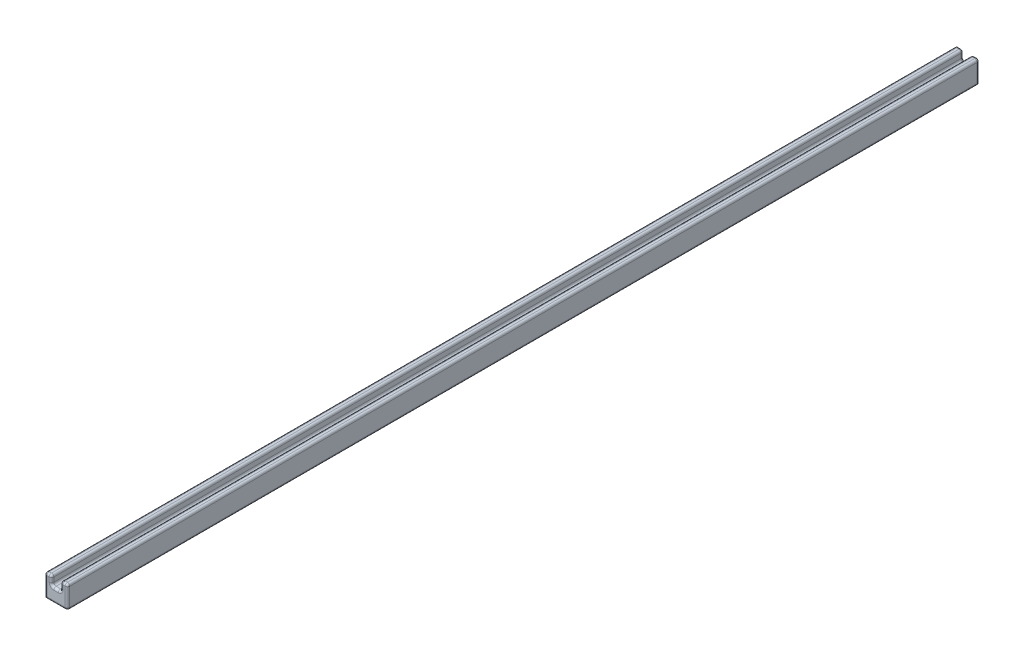
ISO-10303-21;
HEADER;
FILE_DESCRIPTION(('STEP AP214'),'2;1');
FILE_NAME('part.step','',(''),(''),'','','');
FILE_SCHEMA(('AUTOMOTIVE_DESIGN { 1 0 10303 214 1 1 1 1 }'));
ENDSEC;
DATA;
#1=APPLICATION_CONTEXT('core data for automotive mechanical design processes');
#2=APPLICATION_PROTOCOL_DEFINITION('international standard','automotive_design',2000,#1);
#3=PRODUCT_CONTEXT('',#1,'mechanical');
#4=PRODUCT('Part','Part','',(#3));
#5=PRODUCT_RELATED_PRODUCT_CATEGORY('part','',(#4));
#6=PRODUCT_DEFINITION_FORMATION('','',#4);
#7=PRODUCT_DEFINITION_CONTEXT('part definition',#1,'design');
#8=PRODUCT_DEFINITION('design','',#6,#7);
#9=PRODUCT_DEFINITION_SHAPE('','',#8);
#10=(LENGTH_UNIT() NAMED_UNIT(*) SI_UNIT(.MILLI.,.METRE.));
#11=(NAMED_UNIT(*) PLANE_ANGLE_UNIT() SI_UNIT($,.RADIAN.));
#12=(NAMED_UNIT(*) SI_UNIT($,.STERADIAN.) SOLID_ANGLE_UNIT());
#13=UNCERTAINTY_MEASURE_WITH_UNIT(LENGTH_MEASURE(1.E-05),#10,'distance_accuracy_value','');
#14=(GEOMETRIC_REPRESENTATION_CONTEXT(3) GLOBAL_UNCERTAINTY_ASSIGNED_CONTEXT((#13)) GLOBAL_UNIT_ASSIGNED_CONTEXT((#10,
#11,#12)) REPRESENTATION_CONTEXT('',''));
#15=CARTESIAN_POINT('',(0.,0.,0.));
#16=DIRECTION('',(0.,0.,1.));
#17=DIRECTION('',(1.,0.,0.));
#18=AXIS2_PLACEMENT_3D('',#15,#16,#17);
#19=CARTESIAN_POINT('',(0.,-3.02645502645503,-200.));
#20=DIRECTION('',(0.,-1.,0.));
#21=DIRECTION('',(0.,0.,-1.));
#22=AXIS2_PLACEMENT_3D('',#19,#20,#21);
#23=PLANE('',#22);
#24=DIRECTION('',(1.,0.,0.));
#25=VECTOR('',#24,1.);
#26=CARTESIAN_POINT('',(0.,-3.02645502645503,-199.5));
#27=LINE('',#26,#25);
#28=CARTESIAN_POINT('',(15.2857142857143,-3.02645502645503,-199.5));
#29=VERTEX_POINT('',#28);
#30=CARTESIAN_POINT('',(14.7857142857143,-3.02645502645503,-199.5));
#31=VERTEX_POINT('',#30);
#32=EDGE_CURVE('E246',#29,#31,#27,.F.);
#33=ORIENTED_EDGE('',*,*,#32,.T.);
#34=DIRECTION('',(0.,0.,1.));
#35=VECTOR('',#34,1.);
#36=CARTESIAN_POINT('',(14.7857142857143,-3.02645502645503,0.));
#37=LINE('',#36,#35);
#38=CARTESIAN_POINT('',(14.7857142857143,-3.02645502645503,-0.5));
#39=VERTEX_POINT('',#38);
#40=EDGE_CURVE('E251',#31,#39,#37,.T.);
#41=ORIENTED_EDGE('',*,*,#40,.T.);
#42=DIRECTION('',(1.,0.,0.));
#43=VECTOR('',#42,1.);
#44=CARTESIAN_POINT('',(15.7857142857143,-3.02645502645503,-0.5));
#45=LINE('',#44,#43);
#46=CARTESIAN_POINT('',(15.2857142857143,-3.02645502645503,-0.5));
#47=VERTEX_POINT('',#46);
#48=EDGE_CURVE('E248',#39,#47,#45,.T.);
#49=ORIENTED_EDGE('',*,*,#48,.T.);
#50=DIRECTION('',(0.,0.,1.));
#51=VECTOR('',#50,1.);
#52=CARTESIAN_POINT('',(15.2857142857143,-3.02645502645503,-200.));
#53=LINE('',#52,#51);
#54=EDGE_CURVE('E244',#47,#29,#53,.F.);
#55=ORIENTED_EDGE('',*,*,#54,.T.);
#56=EDGE_LOOP('',(#33,#41,#49,#55));
#57=FACE_BOUND('',#56,.T.);
#58=ADVANCED_FACE('F36',(#57),#23,.F.);
#59=CARTESIAN_POINT('',(15.7857142857143,0.,-200.));
#60=DIRECTION('',(-1.,0.,0.));
#61=DIRECTION('',(0.,0.,1.));
#62=AXIS2_PLACEMENT_3D('',#59,#60,#61);
#63=PLANE('',#62);
#64=DIRECTION('',(0.,-1.,0.));
#65=VECTOR('',#64,1.);
#66=CARTESIAN_POINT('',(15.7857142857143,-8.02645502645503,-0.5));
#67=LINE('',#66,#65);
#68=CARTESIAN_POINT('',(15.7857142857143,-3.52645502645503,-0.5));
#69=VERTEX_POINT('',#68);
#70=CARTESIAN_POINT('',(15.7857142857143,-7.52645502645503,-0.5));
#71=VERTEX_POINT('',#70);
#72=EDGE_CURVE('E45',#69,#71,#67,.T.);
#73=ORIENTED_EDGE('',*,*,#72,.T.);
#74=DIRECTION('',(0.,0.,1.));
#75=VECTOR('',#74,1.);
#76=CARTESIAN_POINT('',(15.7857142857143,-7.52645502645503,-200.));
#77=LINE('',#76,#75);
#78=CARTESIAN_POINT('',(15.7857142857143,-7.52645502645503,-199.5));
#79=VERTEX_POINT('',#78);
#80=EDGE_CURVE('E11',#71,#79,#77,.F.);
#81=ORIENTED_EDGE('',*,*,#80,.T.);
#82=DIRECTION('',(0.,-1.,0.));
#83=VECTOR('',#82,1.);
#84=CARTESIAN_POINT('',(15.7857142857143,0.,-199.5));
#85=LINE('',#84,#83);
#86=CARTESIAN_POINT('',(15.7857142857143,-3.52645502645503,-199.5));
#87=VERTEX_POINT('',#86);
#88=EDGE_CURVE('E311',#79,#87,#85,.F.);
#89=ORIENTED_EDGE('',*,*,#88,.T.);
#90=DIRECTION('',(0.,0.,1.));
#91=VECTOR('',#90,1.);
#92=CARTESIAN_POINT('',(15.7857142857143,-3.52645502645503,-200.));
#93=LINE('',#92,#91);
#94=EDGE_CURVE('E309',#87,#69,#93,.T.);
#95=ORIENTED_EDGE('',*,*,#94,.T.);
#96=EDGE_LOOP('',(#73,#81,#89,#95));
#97=FACE_BOUND('',#96,.T.);
#98=ADVANCED_FACE('F496',(#97),#63,.F.);
#99=CARTESIAN_POINT('',(0.,-8.02645502645502,-200.));
#100=DIRECTION('',(0.,-1.,0.));
#101=DIRECTION('',(1.,0.,0.));
#102=AXIS2_PLACEMENT_3D('',#99,#100,#101);
#103=PLANE('',#102);
#104=DIRECTION('',(0.,0.,1.));
#105=VECTOR('',#104,1.);
#106=CARTESIAN_POINT('',(15.2857142857143,-8.02645502645503,0.));
#107=LINE('',#106,#105);
#108=CARTESIAN_POINT('',(15.2857142857143,-8.02645502645503,-200.));
#109=VERTEX_POINT('',#108);
#110=CARTESIAN_POINT('',(15.2857142857143,-8.02645502645503,-0.5));
#111=VERTEX_POINT('',#110);
#112=EDGE_CURVE('E306',#109,#111,#107,.T.);
#113=ORIENTED_EDGE('',*,*,#112,.T.);
#114=DIRECTION('',(1.,0.,0.));
#115=VECTOR('',#114,1.);
#116=CARTESIAN_POINT('',(0.,-8.02645502645502,-0.5));
#117=LINE('',#116,#115);
#118=CARTESIAN_POINT('',(10.7857142857143,-8.02645502645503,-0.5));
#119=VERTEX_POINT('',#118);
#120=EDGE_CURVE('E210',#111,#119,#117,.F.);
#121=ORIENTED_EDGE('',*,*,#120,.T.);
#122=DIRECTION('',(0.,0.,1.));
#123=VECTOR('',#122,1.);
#124=CARTESIAN_POINT('',(10.7857142857143,-8.02645502645503,-200.));
#125=LINE('',#124,#123);
#126=CARTESIAN_POINT('',(10.7857142857143,-8.02645502645503,-200.));
#127=VERTEX_POINT('',#126);
#128=EDGE_CURVE('E196',#127,#119,#125,.T.);
#129=ORIENTED_EDGE('',*,*,#128,.F.);
#130=DIRECTION('',(1.,0.,0.));
#131=VECTOR('',#130,1.);
#132=CARTESIAN_POINT('',(0.,-8.02645502645502,-200.));
#133=LINE('',#132,#131);
#134=EDGE_CURVE('E203',#127,#109,#133,.T.);
#135=ORIENTED_EDGE('',*,*,#134,.T.);
#136=EDGE_LOOP('',(#113,#121,#129,#135));
#137=FACE_BOUND('',#136,.T.);
#138=ADVANCED_FACE('F207',(#137),#103,.T.);
#139=CARTESIAN_POINT('',(10.7857142857143,0.,-200.));
#140=DIRECTION('',(-1.,0.,0.));
#141=DIRECTION('',(0.,-1.,0.));
#142=AXIS2_PLACEMENT_3D('',#139,#140,#141);
#143=PLANE('',#142);
#144=ORIENTED_EDGE('',*,*,#128,.T.);
#145=DIRECTION('',(0.,-1.,0.));
#146=VECTOR('',#145,1.);
#147=CARTESIAN_POINT('',(10.7857142857143,0.,-0.5));
#148=LINE('',#147,#146);
#149=CARTESIAN_POINT('',(10.7857142857143,-3.52645502645503,-0.5));
#150=VERTEX_POINT('',#149);
#151=EDGE_CURVE('E304',#119,#150,#148,.F.);
#152=ORIENTED_EDGE('',*,*,#151,.T.);
#153=DIRECTION('',(0.,0.,1.));
#154=VECTOR('',#153,1.);
#155=CARTESIAN_POINT('',(10.7857142857143,-3.52645502645503,-200.));
#156=LINE('',#155,#154);
#157=CARTESIAN_POINT('',(10.7857142857143,-3.52645502645503,-200.));
#158=VERTEX_POINT('',#157);
#159=EDGE_CURVE('E199',#150,#158,#156,.F.);
#160=ORIENTED_EDGE('',*,*,#159,.T.);
#161=DIRECTION('',(0.,-1.,0.));
#162=VECTOR('',#161,1.);
#163=CARTESIAN_POINT('',(10.7857142857143,0.,-200.));
#164=LINE('',#163,#162);
#165=EDGE_CURVE('E193',#158,#127,#164,.T.);
#166=ORIENTED_EDGE('',*,*,#165,.T.);
#167=EDGE_LOOP('',(#144,#152,#160,#166));
#168=FACE_BOUND('',#167,.T.);
#169=ADVANCED_FACE('F195',(#168),#143,.T.);
#170=DIRECTION('',(1.,0.,0.));
#171=VECTOR('',#170,1.);
#172=CARTESIAN_POINT('',(12.2857142857143,-3.02645502645503,-0.5));
#173=LINE('',#172,#171);
#174=CARTESIAN_POINT('',(11.2857142857143,-3.02645502645503,-0.5));
#175=VERTEX_POINT('',#174);
#176=CARTESIAN_POINT('',(11.7857142857143,-3.02645502645503,-0.5));
#177=VERTEX_POINT('',#176);
#178=EDGE_CURVE('E298',#175,#177,#173,.T.);
#179=ORIENTED_EDGE('',*,*,#178,.T.);
#180=DIRECTION('',(0.,0.,1.));
#181=VECTOR('',#180,1.);
#182=CARTESIAN_POINT('',(11.7857142857143,-3.02645502645503,-200.));
#183=LINE('',#182,#181);
#184=CARTESIAN_POINT('',(11.7857142857143,-3.02645502645503,-199.5));
#185=VERTEX_POINT('',#184);
#186=EDGE_CURVE('E301',#177,#185,#183,.F.);
#187=ORIENTED_EDGE('',*,*,#186,.T.);
#188=DIRECTION('',(1.,0.,0.));
#189=VECTOR('',#188,1.);
#190=CARTESIAN_POINT('',(0.,-3.02645502645503,-199.5));
#191=LINE('',#190,#189);
#192=CARTESIAN_POINT('',(11.2857142857143,-3.02645502645503,-199.5));
#193=VERTEX_POINT('',#192);
#194=EDGE_CURVE('E296',#185,#193,#191,.F.);
#195=ORIENTED_EDGE('',*,*,#194,.T.);
#196=DIRECTION('',(0.,0.,1.));
#197=VECTOR('',#196,1.);
#198=CARTESIAN_POINT('',(11.2857142857143,-3.02645502645503,0.));
#199=LINE('',#198,#197);
#200=EDGE_CURVE('E294',#193,#175,#199,.T.);
#201=ORIENTED_EDGE('',*,*,#200,.T.);
#202=EDGE_LOOP('',(#179,#187,#195,#201));
#203=FACE_BOUND('',#202,.T.);
#204=ADVANCED_FACE('F536',(#203),#23,.F.);
#205=CARTESIAN_POINT('',(12.2857142857143,0.,-200.));
#206=DIRECTION('',(-1.,0.,0.));
#207=DIRECTION('',(0.,-1.,0.));
#208=AXIS2_PLACEMENT_3D('',#205,#206,#207);
#209=PLANE('',#208);
#210=DIRECTION('',(0.,-1.,0.));
#211=VECTOR('',#210,1.);
#212=CARTESIAN_POINT('',(12.2857142857143,-5.02645502645503,-0.5));
#213=LINE('',#212,#211);
#214=CARTESIAN_POINT('',(12.2857142857143,-3.52645502645503,-0.5));
#215=VERTEX_POINT('',#214);
#216=CARTESIAN_POINT('',(12.2857142857143,-4.52645502645503,-0.5));
#217=VERTEX_POINT('',#216);
#218=EDGE_CURVE('E289',#215,#217,#213,.T.);
#219=ORIENTED_EDGE('',*,*,#218,.T.);
#220=DIRECTION('',(0.,0.,1.));
#221=VECTOR('',#220,1.);
#222=CARTESIAN_POINT('',(12.2857142857143,-4.52645502645503,-200.));
#223=LINE('',#222,#221);
#224=CARTESIAN_POINT('',(12.2857142857143,-4.52645502645503,-199.5));
#225=VERTEX_POINT('',#224);
#226=EDGE_CURVE('E292',#217,#225,#223,.F.);
#227=ORIENTED_EDGE('',*,*,#226,.T.);
#228=DIRECTION('',(0.,-1.,0.));
#229=VECTOR('',#228,1.);
#230=CARTESIAN_POINT('',(12.2857142857143,0.,-199.5));
#231=LINE('',#230,#229);
#232=CARTESIAN_POINT('',(12.2857142857143,-3.52645502645503,-199.5));
#233=VERTEX_POINT('',#232);
#234=EDGE_CURVE('E287',#225,#233,#231,.F.);
#235=ORIENTED_EDGE('',*,*,#234,.T.);
#236=DIRECTION('',(0.,0.,1.));
#237=VECTOR('',#236,1.);
#238=CARTESIAN_POINT('',(12.2857142857143,-3.52645502645503,-200.));
#239=LINE('',#238,#237);
#240=EDGE_CURVE('E285',#233,#215,#239,.T.);
#241=ORIENTED_EDGE('',*,*,#240,.T.);
#242=EDGE_LOOP('',(#219,#227,#235,#241));
#243=FACE_BOUND('',#242,.T.);
#244=ADVANCED_FACE('F544',(#243),#209,.F.);
#245=CARTESIAN_POINT('',(0.,-5.02645502645503,-200.));
#246=DIRECTION('',(0.,-1.,0.));
#247=DIRECTION('',(0.,0.,-1.));
#248=AXIS2_PLACEMENT_3D('',#245,#246,#247);
#249=PLANE('',#248);
#250=DIRECTION('',(1.,0.,0.));
#251=VECTOR('',#250,1.);
#252=CARTESIAN_POINT('',(14.2857142857143,-5.02645502645503,-0.5));
#253=LINE('',#252,#251);
#254=CARTESIAN_POINT('',(12.7857142857143,-5.02645502645503,-0.5));
#255=VERTEX_POINT('',#254);
#256=CARTESIAN_POINT('',(13.7857142857143,-5.02645502645503,-0.5));
#257=VERTEX_POINT('',#256);
#258=EDGE_CURVE('E280',#255,#257,#253,.T.);
#259=ORIENTED_EDGE('',*,*,#258,.T.);
#260=DIRECTION('',(0.,0.,1.));
#261=VECTOR('',#260,1.);
#262=CARTESIAN_POINT('',(13.7857142857143,-5.02645502645503,-200.));
#263=LINE('',#262,#261);
#264=CARTESIAN_POINT('',(13.7857142857143,-5.02645502645503,-199.5));
#265=VERTEX_POINT('',#264);
#266=EDGE_CURVE('E283',#257,#265,#263,.F.);
#267=ORIENTED_EDGE('',*,*,#266,.T.);
#268=DIRECTION('',(1.,0.,0.));
#269=VECTOR('',#268,1.);
#270=CARTESIAN_POINT('',(0.,-5.02645502645503,-199.5));
#271=LINE('',#270,#269);
#272=CARTESIAN_POINT('',(12.7857142857143,-5.02645502645503,-199.5));
#273=VERTEX_POINT('',#272);
#274=EDGE_CURVE('E278',#265,#273,#271,.F.);
#275=ORIENTED_EDGE('',*,*,#274,.T.);
#276=DIRECTION('',(0.,0.,1.));
#277=VECTOR('',#276,1.);
#278=CARTESIAN_POINT('',(12.7857142857143,-5.02645502645503,0.));
#279=LINE('',#278,#277);
#280=EDGE_CURVE('E276',#273,#255,#279,.T.);
#281=ORIENTED_EDGE('',*,*,#280,.T.);
#282=EDGE_LOOP('',(#259,#267,#275,#281));
#283=FACE_BOUND('',#282,.T.);
#284=ADVANCED_FACE('F550',(#283),#249,.F.);
#285=CARTESIAN_POINT('',(14.2857142857143,0.,-200.));
#286=DIRECTION('',(-1.,0.,0.));
#287=DIRECTION('',(0.,-1.,0.));
#288=AXIS2_PLACEMENT_3D('',#285,#286,#287);
#289=PLANE('',#288);
#290=DIRECTION('',(0.,-1.,0.));
#291=VECTOR('',#290,1.);
#292=CARTESIAN_POINT('',(14.2857142857143,0.,-0.5));
#293=LINE('',#292,#291);
#294=CARTESIAN_POINT('',(14.2857142857143,-4.52645502645503,-0.5));
#295=VERTEX_POINT('',#294);
#296=CARTESIAN_POINT('',(14.2857142857143,-3.52645502645503,-0.5));
#297=VERTEX_POINT('',#296);
#298=EDGE_CURVE('E219',#295,#297,#293,.F.);
#299=ORIENTED_EDGE('',*,*,#298,.T.);
#300=DIRECTION('',(0.,0.,1.));
#301=VECTOR('',#300,1.);
#302=CARTESIAN_POINT('',(14.2857142857143,-3.52645502645503,-200.));
#303=LINE('',#302,#301);
#304=CARTESIAN_POINT('',(14.2857142857143,-3.52645502645503,-199.5));
#305=VERTEX_POINT('',#304);
#306=EDGE_CURVE('E224',#297,#305,#303,.F.);
#307=ORIENTED_EDGE('',*,*,#306,.T.);
#308=DIRECTION('',(0.,-1.,0.));
#309=VECTOR('',#308,1.);
#310=CARTESIAN_POINT('',(14.2857142857143,-5.02645502645503,-199.5));
#311=LINE('',#310,#309);
#312=CARTESIAN_POINT('',(14.2857142857143,-4.52645502645503,-199.5));
#313=VERTEX_POINT('',#312);
#314=EDGE_CURVE('E221',#305,#313,#311,.T.);
#315=ORIENTED_EDGE('',*,*,#314,.T.);
#316=DIRECTION('',(0.,0.,1.));
#317=VECTOR('',#316,1.);
#318=CARTESIAN_POINT('',(14.2857142857143,-4.52645502645503,-200.));
#319=LINE('',#318,#317);
#320=EDGE_CURVE('E211',#313,#295,#319,.T.);
#321=ORIENTED_EDGE('',*,*,#320,.T.);
#322=EDGE_LOOP('',(#299,#307,#315,#321));
#323=FACE_BOUND('',#322,.T.);
#324=ADVANCED_FACE('F469',(#323),#289,.T.);
#325=CARTESIAN_POINT('',(0.,0.,-200.));
#326=DIRECTION('',(0.,0.,1.));
#327=DIRECTION('',(1.,0.,0.));
#328=AXIS2_PLACEMENT_3D('',#325,#326,#327);
#329=PLANE('',#328);
#330=ORIENTED_EDGE('',*,*,#165,.F.);
#331=DIRECTION('',(1.,0.,0.));
#332=VECTOR('',#331,1.);
#333=CARTESIAN_POINT('',(0.,-3.52645502645503,-200.));
#334=LINE('',#333,#332);
#335=CARTESIAN_POINT('',(11.7857142857143,-3.52645502645503,-200.));
#336=VERTEX_POINT('',#335);
#337=EDGE_CURVE('E242',#158,#336,#334,.T.);
#338=ORIENTED_EDGE('',*,*,#337,.T.);
#339=DIRECTION('',(0.,-1.,0.));
#340=VECTOR('',#339,1.);
#341=CARTESIAN_POINT('',(11.7857142857143,0.,-200.));
#342=LINE('',#341,#340);
#343=CARTESIAN_POINT('',(11.7857142857143,-4.52645502645502,-200.));
#344=VERTEX_POINT('',#343);
#345=EDGE_CURVE('E240',#336,#344,#342,.T.);
#346=ORIENTED_EDGE('',*,*,#345,.T.);
#347=CARTESIAN_POINT('',(12.7857142857143,-4.52645502645503,-200.));
#348=DIRECTION('',(0.,0.,1.));
#349=DIRECTION('',(1.,0.,0.));
#350=AXIS2_PLACEMENT_3D('',#347,#348,#349);
#351=CIRCLE('',#350,1.);
#352=CARTESIAN_POINT('',(12.7857142857143,-5.52645502645503,-200.));
#353=VERTEX_POINT('',#352);
#354=EDGE_CURVE('E237',#353,#344,#351,.F.);
#355=ORIENTED_EDGE('',*,*,#354,.F.);
#356=DIRECTION('',(1.,0.,0.));
#357=VECTOR('',#356,1.);
#358=CARTESIAN_POINT('',(0.,-5.52645502645503,-200.));
#359=LINE('',#358,#357);
#360=CARTESIAN_POINT('',(13.7857142857143,-5.52645502645503,-200.));
#361=VERTEX_POINT('',#360);
#362=EDGE_CURVE('E235',#353,#361,#359,.T.);
#363=ORIENTED_EDGE('',*,*,#362,.T.);
#364=CARTESIAN_POINT('',(13.7857142857143,-4.52645502645503,-200.));
#365=DIRECTION('',(0.,0.,1.));
#366=DIRECTION('',(1.,0.,0.));
#367=AXIS2_PLACEMENT_3D('',#364,#365,#366);
#368=CIRCLE('',#367,1.);
#369=CARTESIAN_POINT('',(14.7857142857143,-4.52645502645503,-200.));
#370=VERTEX_POINT('',#369);
#371=EDGE_CURVE('E232',#370,#361,#368,.F.);
#372=ORIENTED_EDGE('',*,*,#371,.F.);
#373=DIRECTION('',(0.,-1.,0.));
#374=VECTOR('',#373,1.);
#375=CARTESIAN_POINT('',(14.7857142857143,-3.02645502645503,-200.));
#376=LINE('',#375,#374);
#377=CARTESIAN_POINT('',(14.7857142857143,-3.52645502645503,-200.));
#378=VERTEX_POINT('',#377);
#379=EDGE_CURVE('E229',#370,#378,#376,.F.);
#380=ORIENTED_EDGE('',*,*,#379,.T.);
#381=DIRECTION('',(1.,0.,0.));
#382=VECTOR('',#381,1.);
#383=CARTESIAN_POINT('',(0.,-3.52645502645503,-200.));
#384=LINE('',#383,#382);
#385=CARTESIAN_POINT('',(15.2857142857143,-3.52645502645503,-200.));
#386=VERTEX_POINT('',#385);
#387=EDGE_CURVE('E227',#378,#386,#384,.T.);
#388=ORIENTED_EDGE('',*,*,#387,.T.);
#389=DIRECTION('',(0.,-1.,0.));
#390=VECTOR('',#389,1.);
#391=CARTESIAN_POINT('',(15.2857142857143,0.,-200.));
#392=LINE('',#391,#390);
#393=EDGE_CURVE('E215',#386,#109,#392,.T.);
#394=ORIENTED_EDGE('',*,*,#393,.T.);
#395=ORIENTED_EDGE('',*,*,#134,.F.);
#396=EDGE_LOOP('',(#330,#338,#346,#355,#363,#372,#380,#388,#394,#395));
#397=FACE_BOUND('',#396,.T.);
#398=ADVANCED_FACE('F213',(#397),#329,.F.);
#399=CARTESIAN_POINT('',(0.,0.,0.));
#400=DIRECTION('',(0.,0.,1.));
#401=DIRECTION('',(1.,0.,0.));
#402=AXIS2_PLACEMENT_3D('',#399,#400,#401);
#403=PLANE('',#402);
#404=DIRECTION('',(0.,-1.,0.));
#405=VECTOR('',#404,1.);
#406=CARTESIAN_POINT('',(15.2857142857143,-3.02645502645503,0.));
#407=LINE('',#406,#405);
#408=CARTESIAN_POINT('',(15.2857142857143,-7.52645502645503,0.));
#409=VERTEX_POINT('',#408);
#410=CARTESIAN_POINT('',(15.2857142857143,-3.52645502645503,0.));
#411=VERTEX_POINT('',#410);
#412=EDGE_CURVE('E253',#409,#411,#407,.F.);
#413=ORIENTED_EDGE('',*,*,#412,.T.);
#414=DIRECTION('',(1.,0.,0.));
#415=VECTOR('',#414,1.);
#416=CARTESIAN_POINT('',(14.2857142857143,-3.52645502645503,0.));
#417=LINE('',#416,#415);
#418=CARTESIAN_POINT('',(14.7857142857143,-3.52645502645503,0.));
#419=VERTEX_POINT('',#418);
#420=EDGE_CURVE('E273',#411,#419,#417,.F.);
#421=ORIENTED_EDGE('',*,*,#420,.T.);
#422=DIRECTION('',(0.,-1.,0.));
#423=VECTOR('',#422,1.);
#424=CARTESIAN_POINT('',(14.7857142857143,0.,0.));
#425=LINE('',#424,#423);
#426=CARTESIAN_POINT('',(14.7857142857143,-4.52645502645503,0.));
#427=VERTEX_POINT('',#426);
#428=EDGE_CURVE('E271',#419,#427,#425,.T.);
#429=ORIENTED_EDGE('',*,*,#428,.T.);
#430=CARTESIAN_POINT('',(13.7857142857143,-4.52645502645503,0.));
#431=DIRECTION('',(0.,0.,1.));
#432=DIRECTION('',(1.,0.,0.));
#433=AXIS2_PLACEMENT_3D('',#430,#431,#432);
#434=CIRCLE('',#433,1.);
#435=CARTESIAN_POINT('',(13.7857142857143,-5.52645502645503,0.));
#436=VERTEX_POINT('',#435);
#437=EDGE_CURVE('E268',#436,#427,#434,.T.);
#438=ORIENTED_EDGE('',*,*,#437,.F.);
#439=DIRECTION('',(1.,0.,0.));
#440=VECTOR('',#439,1.);
#441=CARTESIAN_POINT('',(12.2857142857143,-5.52645502645503,0.));
#442=LINE('',#441,#440);
#443=CARTESIAN_POINT('',(12.7857142857143,-5.52645502645503,0.));
#444=VERTEX_POINT('',#443);
#445=EDGE_CURVE('E266',#436,#444,#442,.F.);
#446=ORIENTED_EDGE('',*,*,#445,.T.);
#447=CARTESIAN_POINT('',(12.7857142857143,-4.52645502645503,0.));
#448=DIRECTION('',(0.,0.,1.));
#449=DIRECTION('',(1.,0.,0.));
#450=AXIS2_PLACEMENT_3D('',#447,#448,#449);
#451=CIRCLE('',#450,1.);
#452=CARTESIAN_POINT('',(11.7857142857143,-4.52645502645502,0.));
#453=VERTEX_POINT('',#452);
#454=EDGE_CURVE('E263',#453,#444,#451,.T.);
#455=ORIENTED_EDGE('',*,*,#454,.F.);
#456=DIRECTION('',(0.,-1.,0.));
#457=VECTOR('',#456,1.);
#458=CARTESIAN_POINT('',(11.7857142857143,-3.02645502645503,0.));
#459=LINE('',#458,#457);
#460=CARTESIAN_POINT('',(11.7857142857143,-3.52645502645503,0.));
#461=VERTEX_POINT('',#460);
#462=EDGE_CURVE('E261',#453,#461,#459,.F.);
#463=ORIENTED_EDGE('',*,*,#462,.T.);
#464=DIRECTION('',(1.,0.,0.));
#465=VECTOR('',#464,1.);
#466=CARTESIAN_POINT('',(10.7857142857143,-3.52645502645503,0.));
#467=LINE('',#466,#465);
#468=CARTESIAN_POINT('',(11.2857142857143,-3.52645502645503,0.));
#469=VERTEX_POINT('',#468);
#470=EDGE_CURVE('E259',#461,#469,#467,.F.);
#471=ORIENTED_EDGE('',*,*,#470,.T.);
#472=DIRECTION('',(0.,-1.,0.));
#473=VECTOR('',#472,1.);
#474=CARTESIAN_POINT('',(11.2857142857143,0.,0.));
#475=LINE('',#474,#473);
#476=CARTESIAN_POINT('',(11.2857142857143,-7.52645502645503,0.));
#477=VERTEX_POINT('',#476);
#478=EDGE_CURVE('E257',#469,#477,#475,.T.);
#479=ORIENTED_EDGE('',*,*,#478,.T.);
#480=DIRECTION('',(1.,0.,0.));
#481=VECTOR('',#480,1.);
#482=CARTESIAN_POINT('',(0.,-7.52645502645502,0.));
#483=LINE('',#482,#481);
#484=EDGE_CURVE('E255',#477,#409,#483,.T.);
#485=ORIENTED_EDGE('',*,*,#484,.T.);
#486=EDGE_LOOP('',(#413,#421,#429,#438,#446,#455,#463,#471,#479,#485));
#487=FACE_BOUND('',#486,.T.);
#488=ADVANCED_FACE('F512',(#487),#403,.T.);
#489=CARTESIAN_POINT('',(11.2857142857143,0.,-0.5));
#490=DIRECTION('',(0.,-1.,0.));
#491=DIRECTION('',(1.,0.,0.));
#492=AXIS2_PLACEMENT_3D('',#489,#490,#491);
#493=CYLINDRICAL_SURFACE('',#492,0.5);
#494=CARTESIAN_POINT('',(11.2857142857143,-7.52645502645503,-0.5));
#495=DIRECTION('',(0.707106781186547,-0.707106781186547,0.));
#496=DIRECTION('',(0.707106781186548,0.707106781186548,0.));
#497=AXIS2_PLACEMENT_3D('',#494,#495,#496);
#498=ELLIPSE('',#497,0.707106781186547,0.5);
#499=EDGE_CURVE('E418',#477,#119,#498,.T.);
#500=ORIENTED_EDGE('',*,*,#499,.F.);
#501=ORIENTED_EDGE('',*,*,#478,.F.);
#502=CARTESIAN_POINT('',(11.2857142857143,-3.52645502645503,-0.5));
#503=DIRECTION('',(0.,1.,0.));
#504=DIRECTION('',(-1.,0.,0.));
#505=AXIS2_PLACEMENT_3D('',#502,#503,#504);
#506=CIRCLE('',#505,0.5);
#507=EDGE_CURVE('E420',#150,#469,#506,.T.);
#508=ORIENTED_EDGE('',*,*,#507,.F.);
#509=ORIENTED_EDGE('',*,*,#151,.F.);
#510=EDGE_LOOP('',(#500,#501,#508,#509));
#511=FACE_BOUND('',#510,.T.);
#512=ADVANCED_FACE('F38',(#511),#493,.T.);
#513=CARTESIAN_POINT('',(0.,-3.52645502645503,-0.5));
#514=DIRECTION('',(-1.,0.,0.));
#515=DIRECTION('',(0.,0.,1.));
#516=AXIS2_PLACEMENT_3D('',#513,#514,#515);
#517=CYLINDRICAL_SURFACE('',#516,0.5);
#518=CARTESIAN_POINT('',(11.2857142857143,-3.52645502645503,-0.5));
#519=DIRECTION('',(-1.,0.,0.));
#520=DIRECTION('',(0.,0.,1.));
#521=AXIS2_PLACEMENT_3D('',#518,#519,#520);
#522=CIRCLE('',#521,0.5);
#523=EDGE_CURVE('E40',#469,#175,#522,.T.);
#524=ORIENTED_EDGE('',*,*,#523,.F.);
#525=ORIENTED_EDGE('',*,*,#470,.F.);
#526=CARTESIAN_POINT('',(11.7857142857143,-3.52645502645503,-0.5));
#527=DIRECTION('',(1.,0.,0.));
#528=DIRECTION('',(0.,0.,-1.));
#529=AXIS2_PLACEMENT_3D('',#526,#527,#528);
#530=CIRCLE('',#529,0.5);
#531=EDGE_CURVE('E415',#177,#461,#530,.T.);
#532=ORIENTED_EDGE('',*,*,#531,.F.);
#533=ORIENTED_EDGE('',*,*,#178,.F.);
#534=EDGE_LOOP('',(#524,#525,#532,#533));
#535=FACE_BOUND('',#534,.T.);
#536=ADVANCED_FACE('F553',(#535),#517,.T.);
#537=CARTESIAN_POINT('',(11.2857142857143,-3.52645502645503,-0.5));
#538=DIRECTION('',(0.,0.,1.));
#539=DIRECTION('',(1.,0.,0.));
#540=AXIS2_PLACEMENT_3D('',#537,#538,#539);
#541=SPHERICAL_SURFACE('',#540,0.5);
#542=ORIENTED_EDGE('',*,*,#507,.T.);
#543=ORIENTED_EDGE('',*,*,#523,.T.);
#544=CARTESIAN_POINT('',(11.2857142857143,-3.52645502645503,-0.5));
#545=DIRECTION('',(0.,0.,1.));
#546=DIRECTION('',(1.,0.,0.));
#547=AXIS2_PLACEMENT_3D('',#544,#545,#546);
#548=CIRCLE('',#547,0.5);
#549=EDGE_CURVE('E412',#150,#175,#548,.F.);
#550=ORIENTED_EDGE('',*,*,#549,.F.);
#551=EDGE_LOOP('',(#542,#543,#550));
#552=FACE_BOUND('',#551,.T.);
#553=ADVANCED_FACE('F427',(#552),#541,.T.);
#554=CARTESIAN_POINT('',(0.,-7.52645502645502,-0.5));
#555=DIRECTION('',(1.,0.,0.));
#556=DIRECTION('',(0.,1.,0.));
#557=AXIS2_PLACEMENT_3D('',#554,#555,#556);
#558=CYLINDRICAL_SURFACE('',#557,0.5);
#559=ORIENTED_EDGE('',*,*,#499,.T.);
#560=ORIENTED_EDGE('',*,*,#120,.F.);
#561=CARTESIAN_POINT('',(15.2857142857143,-7.52645502645503,-0.5));
#562=DIRECTION('',(1.,0.,0.));
#563=DIRECTION('',(0.,0.,-1.));
#564=AXIS2_PLACEMENT_3D('',#561,#562,#563);
#565=CIRCLE('',#564,0.5);
#566=EDGE_CURVE('E409',#409,#111,#565,.T.);
#567=ORIENTED_EDGE('',*,*,#566,.F.);
#568=ORIENTED_EDGE('',*,*,#484,.F.);
#569=EDGE_LOOP('',(#559,#560,#567,#568));
#570=FACE_BOUND('',#569,.T.);
#571=ADVANCED_FACE('F519',(#570),#558,.T.);
#572=CARTESIAN_POINT('',(11.7857142857143,-3.52645502645503,-0.5));
#573=DIRECTION('',(0.,0.,1.));
#574=DIRECTION('',(1.,0.,0.));
#575=AXIS2_PLACEMENT_3D('',#572,#573,#574);
#576=SPHERICAL_SURFACE('',#575,0.5);
#577=CARTESIAN_POINT('',(11.7857142857143,-3.52645502645503,-0.5));
#578=DIRECTION('',(0.,0.,1.));
#579=DIRECTION('',(1.,0.,0.));
#580=AXIS2_PLACEMENT_3D('',#577,#578,#579);
#581=CIRCLE('',#580,0.5);
#582=EDGE_CURVE('E400',#177,#215,#581,.F.);
#583=ORIENTED_EDGE('',*,*,#582,.F.);
#584=ORIENTED_EDGE('',*,*,#531,.T.);
#585=CARTESIAN_POINT('',(11.7857142857143,-3.52645502645503,-0.5));
#586=DIRECTION('',(0.,1.,0.));
#587=DIRECTION('',(-1.,0.,0.));
#588=AXIS2_PLACEMENT_3D('',#585,#586,#587);
#589=CIRCLE('',#588,0.5);
#590=EDGE_CURVE('E403',#215,#461,#589,.F.);
#591=ORIENTED_EDGE('',*,*,#590,.F.);
#592=EDGE_LOOP('',(#583,#584,#591));
#593=FACE_BOUND('',#592,.T.);
#594=ADVANCED_FACE('F557',(#593),#576,.T.);
#595=CARTESIAN_POINT('',(11.2857142857143,-3.52645502645503,-200.));
#596=DIRECTION('',(0.,0.,-1.));
#597=DIRECTION('',(-1.,0.,0.));
#598=AXIS2_PLACEMENT_3D('',#595,#596,#597);
#599=CYLINDRICAL_SURFACE('',#598,0.5);
#600=ORIENTED_EDGE('',*,*,#549,.T.);
#601=ORIENTED_EDGE('',*,*,#200,.F.);
#602=CARTESIAN_POINT('',(11.2857142857143,-3.52645502645503,-199.5));
#603=DIRECTION('',(0.707106781186547,0.,-0.707106781186547));
#604=DIRECTION('',(-0.707106781186547,0.,-0.707106781186547));
#605=AXIS2_PLACEMENT_3D('',#602,#603,#604);
#606=ELLIPSE('',#605,0.707106781186547,0.5);
#607=EDGE_CURVE('E397',#158,#193,#606,.T.);
#608=ORIENTED_EDGE('',*,*,#607,.F.);
#609=ORIENTED_EDGE('',*,*,#159,.F.);
#610=EDGE_LOOP('',(#600,#601,#608,#609));
#611=FACE_BOUND('',#610,.T.);
#612=ADVANCED_FACE('F433',(#611),#599,.T.);
#613=CARTESIAN_POINT('',(15.2857142857143,-7.52645502645503,-0.5));
#614=DIRECTION('',(0.,0.,1.));
#615=DIRECTION('',(1.,0.,0.));
#616=AXIS2_PLACEMENT_3D('',#613,#614,#615);
#617=SPHERICAL_SURFACE('',#616,0.5);
#618=CARTESIAN_POINT('',(15.2857142857143,-7.52645502645503,-0.5));
#619=DIRECTION('',(0.,0.,1.));
#620=DIRECTION('',(1.,0.,0.));
#621=AXIS2_PLACEMENT_3D('',#618,#619,#620);
#622=CIRCLE('',#621,0.5);
#623=EDGE_CURVE('E395',#71,#111,#622,.F.);
#624=ORIENTED_EDGE('',*,*,#623,.F.);
#625=CARTESIAN_POINT('',(15.2857142857143,-7.52645502645503,-0.5));
#626=DIRECTION('',(0.,-1.,0.));
#627=DIRECTION('',(0.,0.,-1.));
#628=AXIS2_PLACEMENT_3D('',#625,#626,#627);
#629=CIRCLE('',#628,0.5);
#630=EDGE_CURVE('E406',#409,#71,#629,.F.);
#631=ORIENTED_EDGE('',*,*,#630,.F.);
#632=ORIENTED_EDGE('',*,*,#566,.T.);
#633=EDGE_LOOP('',(#624,#631,#632));
#634=FACE_BOUND('',#633,.T.);
#635=ADVANCED_FACE('F521',(#634),#617,.T.);
#636=CARTESIAN_POINT('',(15.2857142857143,0.,-0.5));
#637=DIRECTION('',(0.,1.,0.));
#638=DIRECTION('',(0.,0.,1.));
#639=AXIS2_PLACEMENT_3D('',#636,#637,#638);
#640=CYLINDRICAL_SURFACE('',#639,0.5);
#641=ORIENTED_EDGE('',*,*,#630,.T.);
#642=ORIENTED_EDGE('',*,*,#72,.F.);
#643=CARTESIAN_POINT('',(15.2857142857143,-3.52645502645503,-0.5));
#644=DIRECTION('',(0.,1.,0.));
#645=DIRECTION('',(0.,0.,1.));
#646=AXIS2_PLACEMENT_3D('',#643,#644,#645);
#647=CIRCLE('',#646,0.5);
#648=EDGE_CURVE('E392',#411,#69,#647,.T.);
#649=ORIENTED_EDGE('',*,*,#648,.F.);
#650=ORIENTED_EDGE('',*,*,#412,.F.);
#651=EDGE_LOOP('',(#641,#642,#649,#650));
#652=FACE_BOUND('',#651,.T.);
#653=ADVANCED_FACE('F499',(#652),#640,.T.);
#654=CARTESIAN_POINT('',(11.7857142857143,0.,-0.5));
#655=DIRECTION('',(0.,1.,0.));
#656=DIRECTION('',(-1.,0.,0.));
#657=AXIS2_PLACEMENT_3D('',#654,#655,#656);
#658=CYLINDRICAL_SURFACE('',#657,0.5);
#659=ORIENTED_EDGE('',*,*,#590,.T.);
#660=ORIENTED_EDGE('',*,*,#462,.F.);
#661=CARTESIAN_POINT('',(11.7857142857143,-4.52645502645502,-0.5));
#662=DIRECTION('',(0.,-1.,0.));
#663=DIRECTION('',(1.,0.,0.));
#664=AXIS2_PLACEMENT_3D('',#661,#662,#663);
#665=CIRCLE('',#664,0.5);
#666=EDGE_CURVE('E389',#217,#453,#665,.T.);
#667=ORIENTED_EDGE('',*,*,#666,.F.);
#668=ORIENTED_EDGE('',*,*,#218,.F.);
#669=EDGE_LOOP('',(#659,#660,#667,#668));
#670=FACE_BOUND('',#669,.T.);
#671=ADVANCED_FACE('F561',(#670),#658,.T.);
#672=CARTESIAN_POINT('',(11.7857142857143,-3.52645502645503,-200.));
#673=DIRECTION('',(0.,0.,1.));
#674=DIRECTION('',(1.,0.,0.));
#675=AXIS2_PLACEMENT_3D('',#672,#673,#674);
#676=CYLINDRICAL_SURFACE('',#675,0.5);
#677=ORIENTED_EDGE('',*,*,#582,.T.);
#678=ORIENTED_EDGE('',*,*,#240,.F.);
#679=CARTESIAN_POINT('',(11.7857142857143,-3.52645502645503,-199.5));
#680=DIRECTION('',(0.,0.,-1.));
#681=DIRECTION('',(-1.,0.,0.));
#682=AXIS2_PLACEMENT_3D('',#679,#680,#681);
#683=CIRCLE('',#682,0.5);
#684=EDGE_CURVE('E386',#185,#233,#683,.T.);
#685=ORIENTED_EDGE('',*,*,#684,.F.);
#686=ORIENTED_EDGE('',*,*,#186,.F.);
#687=EDGE_LOOP('',(#677,#678,#685,#686));
#688=FACE_BOUND('',#687,.T.);
#689=ADVANCED_FACE('F531',(#688),#676,.T.);
#690=CARTESIAN_POINT('',(0.,-3.52645502645503,-199.5));
#691=DIRECTION('',(1.,0.,0.));
#692=DIRECTION('',(0.,0.,-1.));
#693=AXIS2_PLACEMENT_3D('',#690,#691,#692);
#694=CYLINDRICAL_SURFACE('',#693,0.5);
#695=ORIENTED_EDGE('',*,*,#607,.T.);
#696=ORIENTED_EDGE('',*,*,#194,.F.);
#697=CARTESIAN_POINT('',(11.7857142857143,-3.52645502645503,-199.5));
#698=DIRECTION('',(1.,0.,0.));
#699=DIRECTION('',(0.,0.,-1.));
#700=AXIS2_PLACEMENT_3D('',#697,#698,#699);
#701=CIRCLE('',#700,0.5);
#702=EDGE_CURVE('E383',#336,#185,#701,.T.);
#703=ORIENTED_EDGE('',*,*,#702,.F.);
#704=ORIENTED_EDGE('',*,*,#337,.F.);
#705=EDGE_LOOP('',(#695,#696,#703,#704));
#706=FACE_BOUND('',#705,.T.);
#707=ADVANCED_FACE('F438',(#706),#694,.T.);
#708=CARTESIAN_POINT('',(15.2857142857143,-7.52645502645503,-200.));
#709=DIRECTION('',(0.,0.,-1.));
#710=DIRECTION('',(-1.,0.,0.));
#711=AXIS2_PLACEMENT_3D('',#708,#709,#710);
#712=CYLINDRICAL_SURFACE('',#711,0.5);
#713=ORIENTED_EDGE('',*,*,#623,.T.);
#714=ORIENTED_EDGE('',*,*,#112,.F.);
#715=CARTESIAN_POINT('',(15.2857142857143,-7.52645502645503,-199.5));
#716=DIRECTION('',(0.,0.707106781186547,-0.707106781186547));
#717=DIRECTION('',(0.,-0.707106781186547,-0.707106781186547));
#718=AXIS2_PLACEMENT_3D('',#715,#716,#717);
#719=ELLIPSE('',#718,0.707106781186547,0.5);
#720=EDGE_CURVE('E380',#79,#109,#719,.T.);
#721=ORIENTED_EDGE('',*,*,#720,.F.);
#722=ORIENTED_EDGE('',*,*,#80,.F.);
#723=EDGE_LOOP('',(#713,#714,#721,#722));
#724=FACE_BOUND('',#723,.T.);
#725=ADVANCED_FACE('F522',(#724),#712,.T.);
#726=CARTESIAN_POINT('',(15.2857142857143,-3.52645502645503,-0.5));
#727=DIRECTION('',(0.,0.,1.));
#728=DIRECTION('',(1.,0.,0.));
#729=AXIS2_PLACEMENT_3D('',#726,#727,#728);
#730=SPHERICAL_SURFACE('',#729,0.5);
#731=CARTESIAN_POINT('',(15.2857142857143,-3.52645502645503,-0.5));
#732=DIRECTION('',(1.,0.,0.));
#733=DIRECTION('',(0.,0.,-1.));
#734=AXIS2_PLACEMENT_3D('',#731,#732,#733);
#735=CIRCLE('',#734,0.5);
#736=EDGE_CURVE('E374',#411,#47,#735,.F.);
#737=ORIENTED_EDGE('',*,*,#736,.F.);
#738=ORIENTED_EDGE('',*,*,#648,.T.);
#739=CARTESIAN_POINT('',(15.2857142857143,-3.52645502645503,-0.5));
#740=DIRECTION('',(0.,0.,1.));
#741=DIRECTION('',(1.,0.,0.));
#742=AXIS2_PLACEMENT_3D('',#739,#740,#741);
#743=CIRCLE('',#742,0.5);
#744=EDGE_CURVE('E377',#47,#69,#743,.F.);
#745=ORIENTED_EDGE('',*,*,#744,.F.);
#746=EDGE_LOOP('',(#737,#738,#745));
#747=FACE_BOUND('',#746,.T.);
#748=ADVANCED_FACE('F504',(#747),#730,.T.);
#749=CARTESIAN_POINT('',(12.7857142857143,-4.52645502645503,-0.5));
#750=DIRECTION('',(0.,0.,1.));
#751=DIRECTION('',(1.,0.,0.));
#752=AXIS2_PLACEMENT_3D('',#749,#750,#751);
#753=TOROIDAL_SURFACE('',#752,1.,0.5);
#754=ORIENTED_EDGE('',*,*,#666,.T.);
#755=ORIENTED_EDGE('',*,*,#454,.T.);
#756=CARTESIAN_POINT('',(12.7857142857143,-5.52645502645503,-0.5));
#757=DIRECTION('',(-1.,0.,0.));
#758=DIRECTION('',(0.,0.,1.));
#759=AXIS2_PLACEMENT_3D('',#756,#757,#758);
#760=CIRCLE('',#759,0.5);
#761=EDGE_CURVE('E371',#255,#444,#760,.F.);
#762=ORIENTED_EDGE('',*,*,#761,.F.);
#763=CARTESIAN_POINT('',(12.7857142857143,-4.52645502645503,-0.5));
#764=DIRECTION('',(0.,0.,1.));
#765=DIRECTION('',(1.,0.,0.));
#766=AXIS2_PLACEMENT_3D('',#763,#764,#765);
#767=CIRCLE('',#766,0.5);
#768=EDGE_CURVE('E368',#217,#255,#767,.T.);
#769=ORIENTED_EDGE('',*,*,#768,.F.);
#770=EDGE_LOOP('',(#754,#755,#762,#769));
#771=FACE_BOUND('',#770,.T.);
#772=ADVANCED_FACE('F529',(#771),#753,.T.);
#773=CARTESIAN_POINT('',(11.7857142857143,-3.52645502645503,-199.5));
#774=DIRECTION('',(0.,0.,1.));
#775=DIRECTION('',(1.,0.,0.));
#776=AXIS2_PLACEMENT_3D('',#773,#774,#775);
#777=SPHERICAL_SURFACE('',#776,0.5);
#778=ORIENTED_EDGE('',*,*,#702,.T.);
#779=ORIENTED_EDGE('',*,*,#684,.T.);
#780=CARTESIAN_POINT('',(11.7857142857143,-3.52645502645503,-199.5));
#781=DIRECTION('',(0.,1.,0.));
#782=DIRECTION('',(-1.,0.,0.));
#783=AXIS2_PLACEMENT_3D('',#780,#781,#782);
#784=CIRCLE('',#783,0.5);
#785=EDGE_CURVE('E365',#336,#233,#784,.F.);
#786=ORIENTED_EDGE('',*,*,#785,.F.);
#787=EDGE_LOOP('',(#778,#779,#786));
#788=FACE_BOUND('',#787,.T.);
#789=ADVANCED_FACE('F567',(#788),#777,.T.);
#790=CARTESIAN_POINT('',(15.2857142857143,0.,-199.5));
#791=DIRECTION('',(0.,-1.,0.));
#792=DIRECTION('',(0.,0.,-1.));
#793=AXIS2_PLACEMENT_3D('',#790,#791,#792);
#794=CYLINDRICAL_SURFACE('',#793,0.5);
#795=ORIENTED_EDGE('',*,*,#720,.T.);
#796=ORIENTED_EDGE('',*,*,#393,.F.);
#797=CARTESIAN_POINT('',(15.2857142857143,-3.52645502645503,-199.5));
#798=DIRECTION('',(0.,1.,0.));
#799=DIRECTION('',(0.,0.,1.));
#800=AXIS2_PLACEMENT_3D('',#797,#798,#799);
#801=CIRCLE('',#800,0.5);
#802=EDGE_CURVE('E362',#87,#386,#801,.T.);
#803=ORIENTED_EDGE('',*,*,#802,.F.);
#804=ORIENTED_EDGE('',*,*,#88,.F.);
#805=EDGE_LOOP('',(#795,#796,#803,#804));
#806=FACE_BOUND('',#805,.T.);
#807=ADVANCED_FACE('F486',(#806),#794,.T.);
#808=CARTESIAN_POINT('',(15.2857142857143,-3.52645502645503,-200.));
#809=DIRECTION('',(0.,0.,1.));
#810=DIRECTION('',(1.,0.,0.));
#811=AXIS2_PLACEMENT_3D('',#808,#809,#810);
#812=CYLINDRICAL_SURFACE('',#811,0.5);
#813=ORIENTED_EDGE('',*,*,#744,.T.);
#814=ORIENTED_EDGE('',*,*,#94,.F.);
#815=CARTESIAN_POINT('',(15.2857142857143,-3.52645502645503,-199.5));
#816=DIRECTION('',(0.,0.,-1.));
#817=DIRECTION('',(-1.,0.,0.));
#818=AXIS2_PLACEMENT_3D('',#815,#816,#817);
#819=CIRCLE('',#818,0.5);
#820=EDGE_CURVE('E359',#29,#87,#819,.T.);
#821=ORIENTED_EDGE('',*,*,#820,.F.);
#822=ORIENTED_EDGE('',*,*,#54,.F.);
#823=EDGE_LOOP('',(#813,#814,#821,#822));
#824=FACE_BOUND('',#823,.T.);
#825=ADVANCED_FACE('F493',(#824),#812,.T.);
#826=CARTESIAN_POINT('',(0.,-3.52645502645503,-0.5));
#827=DIRECTION('',(-1.,0.,0.));
#828=DIRECTION('',(0.,0.,1.));
#829=AXIS2_PLACEMENT_3D('',#826,#827,#828);
#830=CYLINDRICAL_SURFACE('',#829,0.5);
#831=ORIENTED_EDGE('',*,*,#736,.T.);
#832=ORIENTED_EDGE('',*,*,#48,.F.);
#833=CARTESIAN_POINT('',(14.7857142857143,-3.52645502645503,-0.5));
#834=DIRECTION('',(-1.,0.,0.));
#835=DIRECTION('',(0.,0.,1.));
#836=AXIS2_PLACEMENT_3D('',#833,#834,#835);
#837=CIRCLE('',#836,0.5);
#838=EDGE_CURVE('E356',#419,#39,#837,.T.);
#839=ORIENTED_EDGE('',*,*,#838,.F.);
#840=ORIENTED_EDGE('',*,*,#420,.F.);
#841=EDGE_LOOP('',(#831,#832,#839,#840));
#842=FACE_BOUND('',#841,.T.);
#843=ADVANCED_FACE('F509',(#842),#830,.T.);
#844=CARTESIAN_POINT('',(14.7857142857143,0.,-0.5));
#845=DIRECTION('',(0.,-1.,0.));
#846=DIRECTION('',(1.,0.,0.));
#847=AXIS2_PLACEMENT_3D('',#844,#845,#846);
#848=CYLINDRICAL_SURFACE('',#847,0.5);
#849=CARTESIAN_POINT('',(14.7857142857143,-4.52645502645503,-0.5));
#850=DIRECTION('',(0.,-1.,0.));
#851=DIRECTION('',(1.,0.,0.));
#852=AXIS2_PLACEMENT_3D('',#849,#850,#851);
#853=CIRCLE('',#852,0.5);
#854=EDGE_CURVE('E351',#427,#295,#853,.T.);
#855=ORIENTED_EDGE('',*,*,#854,.F.);
#856=ORIENTED_EDGE('',*,*,#428,.F.);
#857=CARTESIAN_POINT('',(14.7857142857143,-3.52645502645503,-0.5));
#858=DIRECTION('',(0.,1.,0.));
#859=DIRECTION('',(-1.,0.,0.));
#860=AXIS2_PLACEMENT_3D('',#857,#858,#859);
#861=CIRCLE('',#860,0.5);
#862=EDGE_CURVE('E354',#297,#419,#861,.T.);
#863=ORIENTED_EDGE('',*,*,#862,.F.);
#864=ORIENTED_EDGE('',*,*,#298,.F.);
#865=EDGE_LOOP('',(#855,#856,#863,#864));
#866=FACE_BOUND('',#865,.T.);
#867=ADVANCED_FACE('F582',(#866),#848,.T.);
#868=CARTESIAN_POINT('',(0.,-5.52645502645503,-0.5));
#869=DIRECTION('',(-1.,0.,0.));
#870=DIRECTION('',(0.,0.,1.));
#871=AXIS2_PLACEMENT_3D('',#868,#869,#870);
#872=CYLINDRICAL_SURFACE('',#871,0.5);
#873=ORIENTED_EDGE('',*,*,#761,.T.);
#874=ORIENTED_EDGE('',*,*,#445,.F.);
#875=CARTESIAN_POINT('',(13.7857142857143,-5.52645502645503,-0.5));
#876=DIRECTION('',(1.,0.,0.));
#877=DIRECTION('',(0.,0.,-1.));
#878=AXIS2_PLACEMENT_3D('',#875,#876,#877);
#879=CIRCLE('',#878,0.5);
#880=EDGE_CURVE('E348',#257,#436,#879,.T.);
#881=ORIENTED_EDGE('',*,*,#880,.F.);
#882=ORIENTED_EDGE('',*,*,#258,.F.);
#883=EDGE_LOOP('',(#873,#874,#881,#882));
#884=FACE_BOUND('',#883,.T.);
#885=ADVANCED_FACE('F585',(#884),#872,.T.);
#886=CARTESIAN_POINT('',(12.7857142857143,-4.52645502645503,-200.));
#887=DIRECTION('',(0.,0.,-1.));
#888=DIRECTION('',(-1.,0.,0.));
#889=AXIS2_PLACEMENT_3D('',#886,#887,#888);
#890=CYLINDRICAL_SURFACE('',#889,0.5);
#891=ORIENTED_EDGE('',*,*,#768,.T.);
#892=ORIENTED_EDGE('',*,*,#280,.F.);
#893=CARTESIAN_POINT('',(12.7857142857143,-4.52645502645503,-199.5));
#894=DIRECTION('',(0.,0.,1.));
#895=DIRECTION('',(1.,0.,0.));
#896=AXIS2_PLACEMENT_3D('',#893,#894,#895);
#897=CIRCLE('',#896,0.5);
#898=EDGE_CURVE('E345',#225,#273,#897,.T.);
#899=ORIENTED_EDGE('',*,*,#898,.F.);
#900=ORIENTED_EDGE('',*,*,#226,.F.);
#901=EDGE_LOOP('',(#891,#892,#899,#900));
#902=FACE_BOUND('',#901,.T.);
#903=ADVANCED_FACE('F589',(#902),#890,.F.);
#904=CARTESIAN_POINT('',(11.7857142857143,0.,-199.5));
#905=DIRECTION('',(0.,-1.,0.));
#906=DIRECTION('',(1.,0.,0.));
#907=AXIS2_PLACEMENT_3D('',#904,#905,#906);
#908=CYLINDRICAL_SURFACE('',#907,0.5);
#909=ORIENTED_EDGE('',*,*,#785,.T.);
#910=ORIENTED_EDGE('',*,*,#234,.F.);
#911=CARTESIAN_POINT('',(11.7857142857143,-4.52645502645502,-199.5));
#912=DIRECTION('',(0.,-1.,0.));
#913=DIRECTION('',(1.,0.,0.));
#914=AXIS2_PLACEMENT_3D('',#911,#912,#913);
#915=CIRCLE('',#914,0.5);
#916=EDGE_CURVE('E342',#344,#225,#915,.T.);
#917=ORIENTED_EDGE('',*,*,#916,.F.);
#918=ORIENTED_EDGE('',*,*,#345,.F.);
#919=EDGE_LOOP('',(#909,#910,#917,#918));
#920=FACE_BOUND('',#919,.T.);
#921=ADVANCED_FACE('F445',(#920),#908,.T.);
#922=CARTESIAN_POINT('',(15.2857142857143,-3.52645502645503,-199.5));
#923=DIRECTION('',(0.,0.,1.));
#924=DIRECTION('',(1.,0.,0.));
#925=AXIS2_PLACEMENT_3D('',#922,#923,#924);
#926=SPHERICAL_SURFACE('',#925,0.5);
#927=ORIENTED_EDGE('',*,*,#820,.T.);
#928=ORIENTED_EDGE('',*,*,#802,.T.);
#929=CARTESIAN_POINT('',(15.2857142857143,-3.52645502645503,-199.5));
#930=DIRECTION('',(1.,0.,0.));
#931=DIRECTION('',(0.,0.,-1.));
#932=AXIS2_PLACEMENT_3D('',#929,#930,#931);
#933=CIRCLE('',#932,0.5);
#934=EDGE_CURVE('E339',#29,#386,#933,.F.);
#935=ORIENTED_EDGE('',*,*,#934,.F.);
#936=EDGE_LOOP('',(#927,#928,#935));
#937=FACE_BOUND('',#936,.T.);
#938=ADVANCED_FACE('F489',(#937),#926,.T.);
#939=CARTESIAN_POINT('',(14.7857142857143,-3.52645502645503,-0.5));
#940=DIRECTION('',(0.,0.,1.));
#941=DIRECTION('',(1.,0.,0.));
#942=AXIS2_PLACEMENT_3D('',#939,#940,#941);
#943=SPHERICAL_SURFACE('',#942,0.5);
#944=ORIENTED_EDGE('',*,*,#862,.T.);
#945=ORIENTED_EDGE('',*,*,#838,.T.);
#946=CARTESIAN_POINT('',(14.7857142857143,-3.52645502645503,-0.5));
#947=DIRECTION('',(0.,0.,1.));
#948=DIRECTION('',(1.,0.,0.));
#949=AXIS2_PLACEMENT_3D('',#946,#947,#948);
#950=CIRCLE('',#949,0.5);
#951=EDGE_CURVE('E336',#297,#39,#950,.F.);
#952=ORIENTED_EDGE('',*,*,#951,.F.);
#953=EDGE_LOOP('',(#944,#945,#952));
#954=FACE_BOUND('',#953,.T.);
#955=ADVANCED_FACE('F598',(#954),#943,.T.);
#956=CARTESIAN_POINT('',(13.7857142857143,-4.52645502645503,-0.5));
#957=DIRECTION('',(0.,0.,1.));
#958=DIRECTION('',(1.,0.,0.));
#959=AXIS2_PLACEMENT_3D('',#956,#957,#958);
#960=TOROIDAL_SURFACE('',#959,1.,0.5);
#961=ORIENTED_EDGE('',*,*,#437,.T.);
#962=ORIENTED_EDGE('',*,*,#854,.T.);
#963=CARTESIAN_POINT('',(13.7857142857143,-4.52645502645503,-0.5));
#964=DIRECTION('',(0.,0.,1.));
#965=DIRECTION('',(1.,0.,0.));
#966=AXIS2_PLACEMENT_3D('',#963,#964,#965);
#967=CIRCLE('',#966,0.5);
#968=EDGE_CURVE('E333',#257,#295,#967,.T.);
#969=ORIENTED_EDGE('',*,*,#968,.F.);
#970=ORIENTED_EDGE('',*,*,#880,.T.);
#971=EDGE_LOOP('',(#961,#962,#969,#970));
#972=FACE_BOUND('',#971,.T.);
#973=ADVANCED_FACE('F601',(#972),#960,.T.);
#974=CARTESIAN_POINT('',(12.7857142857143,-4.52645502645503,-199.5));
#975=DIRECTION('',(0.,0.,1.));
#976=DIRECTION('',(1.,0.,0.));
#977=AXIS2_PLACEMENT_3D('',#974,#975,#976);
#978=TOROIDAL_SURFACE('',#977,1.,0.5);
#979=ORIENTED_EDGE('',*,*,#916,.T.);
#980=ORIENTED_EDGE('',*,*,#898,.T.);
#981=CARTESIAN_POINT('',(12.7857142857143,-5.52645502645503,-199.5));
#982=DIRECTION('',(-1.,0.,0.));
#983=DIRECTION('',(0.,0.,1.));
#984=AXIS2_PLACEMENT_3D('',#981,#982,#983);
#985=CIRCLE('',#984,0.5);
#986=EDGE_CURVE('E330',#353,#273,#985,.F.);
#987=ORIENTED_EDGE('',*,*,#986,.F.);
#988=ORIENTED_EDGE('',*,*,#354,.T.);
#989=EDGE_LOOP('',(#979,#980,#987,#988));
#990=FACE_BOUND('',#989,.T.);
#991=ADVANCED_FACE('F448',(#990),#978,.T.);
#992=CARTESIAN_POINT('',(0.,-3.52645502645503,-199.5));
#993=DIRECTION('',(1.,0.,0.));
#994=DIRECTION('',(0.,0.,-1.));
#995=AXIS2_PLACEMENT_3D('',#992,#993,#994);
#996=CYLINDRICAL_SURFACE('',#995,0.5);
#997=ORIENTED_EDGE('',*,*,#934,.T.);
#998=ORIENTED_EDGE('',*,*,#387,.F.);
#999=CARTESIAN_POINT('',(14.7857142857143,-3.52645502645503,-199.5));
#1000=DIRECTION('',(-1.,0.,0.));
#1001=DIRECTION('',(0.,0.,1.));
#1002=AXIS2_PLACEMENT_3D('',#999,#1000,#1001);
#1003=CIRCLE('',#1002,0.5);
#1004=EDGE_CURVE('E327',#31,#378,#1003,.T.);
#1005=ORIENTED_EDGE('',*,*,#1004,.F.);
#1006=ORIENTED_EDGE('',*,*,#32,.F.);
#1007=EDGE_LOOP('',(#997,#998,#1005,#1006));
#1008=FACE_BOUND('',#1007,.T.);
#1009=ADVANCED_FACE('F482',(#1008),#996,.T.);
#1010=CARTESIAN_POINT('',(14.7857142857143,-3.52645502645503,-200.));
#1011=DIRECTION('',(0.,0.,-1.));
#1012=DIRECTION('',(-1.,0.,0.));
#1013=AXIS2_PLACEMENT_3D('',#1010,#1011,#1012);
#1014=CYLINDRICAL_SURFACE('',#1013,0.5);
#1015=ORIENTED_EDGE('',*,*,#951,.T.);
#1016=ORIENTED_EDGE('',*,*,#40,.F.);
#1017=CARTESIAN_POINT('',(14.7857142857143,-3.52645502645503,-199.5));
#1018=DIRECTION('',(0.,0.,-1.));
#1019=DIRECTION('',(-1.,0.,0.));
#1020=AXIS2_PLACEMENT_3D('',#1017,#1018,#1019);
#1021=CIRCLE('',#1020,0.5);
#1022=EDGE_CURVE('E324',#305,#31,#1021,.T.);
#1023=ORIENTED_EDGE('',*,*,#1022,.F.);
#1024=ORIENTED_EDGE('',*,*,#306,.F.);
#1025=EDGE_LOOP('',(#1015,#1016,#1023,#1024));
#1026=FACE_BOUND('',#1025,.T.);
#1027=ADVANCED_FACE('F475',(#1026),#1014,.T.);
#1028=CARTESIAN_POINT('',(13.7857142857143,-4.52645502645503,-200.));
#1029=DIRECTION('',(0.,0.,1.));
#1030=DIRECTION('',(1.,0.,0.));
#1031=AXIS2_PLACEMENT_3D('',#1028,#1029,#1030);
#1032=CYLINDRICAL_SURFACE('',#1031,0.5);
#1033=ORIENTED_EDGE('',*,*,#968,.T.);
#1034=ORIENTED_EDGE('',*,*,#320,.F.);
#1035=CARTESIAN_POINT('',(13.7857142857143,-4.52645502645503,-199.5));
#1036=DIRECTION('',(0.,0.,1.));
#1037=DIRECTION('',(1.,0.,0.));
#1038=AXIS2_PLACEMENT_3D('',#1035,#1036,#1037);
#1039=CIRCLE('',#1038,0.5);
#1040=EDGE_CURVE('E321',#265,#313,#1039,.T.);
#1041=ORIENTED_EDGE('',*,*,#1040,.F.);
#1042=ORIENTED_EDGE('',*,*,#266,.F.);
#1043=EDGE_LOOP('',(#1033,#1034,#1041,#1042));
#1044=FACE_BOUND('',#1043,.T.);
#1045=ADVANCED_FACE('F465',(#1044),#1032,.F.);
#1046=CARTESIAN_POINT('',(0.,-5.52645502645503,-199.5));
#1047=DIRECTION('',(1.,0.,0.));
#1048=DIRECTION('',(0.,0.,-1.));
#1049=AXIS2_PLACEMENT_3D('',#1046,#1047,#1048);
#1050=CYLINDRICAL_SURFACE('',#1049,0.5);
#1051=ORIENTED_EDGE('',*,*,#986,.T.);
#1052=ORIENTED_EDGE('',*,*,#274,.F.);
#1053=CARTESIAN_POINT('',(13.7857142857143,-5.52645502645503,-199.5));
#1054=DIRECTION('',(1.,0.,0.));
#1055=DIRECTION('',(0.,0.,-1.));
#1056=AXIS2_PLACEMENT_3D('',#1053,#1054,#1055);
#1057=CIRCLE('',#1056,0.5);
#1058=EDGE_CURVE('E318',#361,#265,#1057,.T.);
#1059=ORIENTED_EDGE('',*,*,#1058,.F.);
#1060=ORIENTED_EDGE('',*,*,#362,.F.);
#1061=EDGE_LOOP('',(#1051,#1052,#1059,#1060));
#1062=FACE_BOUND('',#1061,.T.);
#1063=ADVANCED_FACE('F453',(#1062),#1050,.T.);
#1064=CARTESIAN_POINT('',(14.7857142857143,-3.52645502645503,-199.5));
#1065=DIRECTION('',(0.,0.,1.));
#1066=DIRECTION('',(1.,0.,0.));
#1067=AXIS2_PLACEMENT_3D('',#1064,#1065,#1066);
#1068=SPHERICAL_SURFACE('',#1067,0.5);
#1069=ORIENTED_EDGE('',*,*,#1022,.T.);
#1070=ORIENTED_EDGE('',*,*,#1004,.T.);
#1071=CARTESIAN_POINT('',(14.7857142857143,-3.52645502645503,-199.5));
#1072=DIRECTION('',(0.,1.,0.));
#1073=DIRECTION('',(-1.,0.,0.));
#1074=AXIS2_PLACEMENT_3D('',#1071,#1072,#1073);
#1075=CIRCLE('',#1074,0.5);
#1076=EDGE_CURVE('E316',#305,#378,#1075,.F.);
#1077=ORIENTED_EDGE('',*,*,#1076,.F.);
#1078=EDGE_LOOP('',(#1069,#1070,#1077));
#1079=FACE_BOUND('',#1078,.T.);
#1080=ADVANCED_FACE('F478',(#1079),#1068,.T.);
#1081=CARTESIAN_POINT('',(13.7857142857143,-4.52645502645503,-199.5));
#1082=DIRECTION('',(0.,0.,1.));
#1083=DIRECTION('',(1.,0.,0.));
#1084=AXIS2_PLACEMENT_3D('',#1081,#1082,#1083);
#1085=TOROIDAL_SURFACE('',#1084,1.,0.5);
#1086=ORIENTED_EDGE('',*,*,#1058,.T.);
#1087=ORIENTED_EDGE('',*,*,#1040,.T.);
#1088=CARTESIAN_POINT('',(14.7857142857143,-4.52645502645503,-199.5));
#1089=DIRECTION('',(0.,-1.,0.));
#1090=DIRECTION('',(1.,0.,0.));
#1091=AXIS2_PLACEMENT_3D('',#1088,#1089,#1090);
#1092=CIRCLE('',#1091,0.5);
#1093=EDGE_CURVE('E314',#370,#313,#1092,.F.);
#1094=ORIENTED_EDGE('',*,*,#1093,.F.);
#1095=ORIENTED_EDGE('',*,*,#371,.T.);
#1096=EDGE_LOOP('',(#1086,#1087,#1094,#1095));
#1097=FACE_BOUND('',#1096,.T.);
#1098=ADVANCED_FACE('F461',(#1097),#1085,.T.);
#1099=CARTESIAN_POINT('',(14.7857142857143,0.,-199.5));
#1100=DIRECTION('',(0.,1.,0.));
#1101=DIRECTION('',(-1.,0.,0.));
#1102=AXIS2_PLACEMENT_3D('',#1099,#1100,#1101);
#1103=CYLINDRICAL_SURFACE('',#1102,0.5);
#1104=ORIENTED_EDGE('',*,*,#1076,.T.);
#1105=ORIENTED_EDGE('',*,*,#379,.F.);
#1106=ORIENTED_EDGE('',*,*,#1093,.T.);
#1107=ORIENTED_EDGE('',*,*,#314,.F.);
#1108=EDGE_LOOP('',(#1104,#1105,#1106,#1107));
#1109=FACE_BOUND('',#1108,.T.);
#1110=ADVANCED_FACE('F458',(#1109),#1103,.T.);
#1111=CLOSED_SHELL('',(#58,#98,#138,#169,#204,#244,#284,#324,#398,#488,#512,#536,#553,#571,#594,
#612,#635,#653,#671,#689,#707,#725,#748,#772,#789,#807,#825,#843,#867,#885,#903,#921,#938,#955,
#973,#991,#1009,#1027,#1045,#1063,#1080,#1098,#1110));
#1112=MANIFOLD_SOLID_BREP('B2',#1111);
#1113=ADVANCED_BREP_SHAPE_REPRESENTATION('',(#18,#1112),#14);
#1114=SHAPE_DEFINITION_REPRESENTATION(#9,#1113);
ENDSEC;
END-ISO-10303-21;
